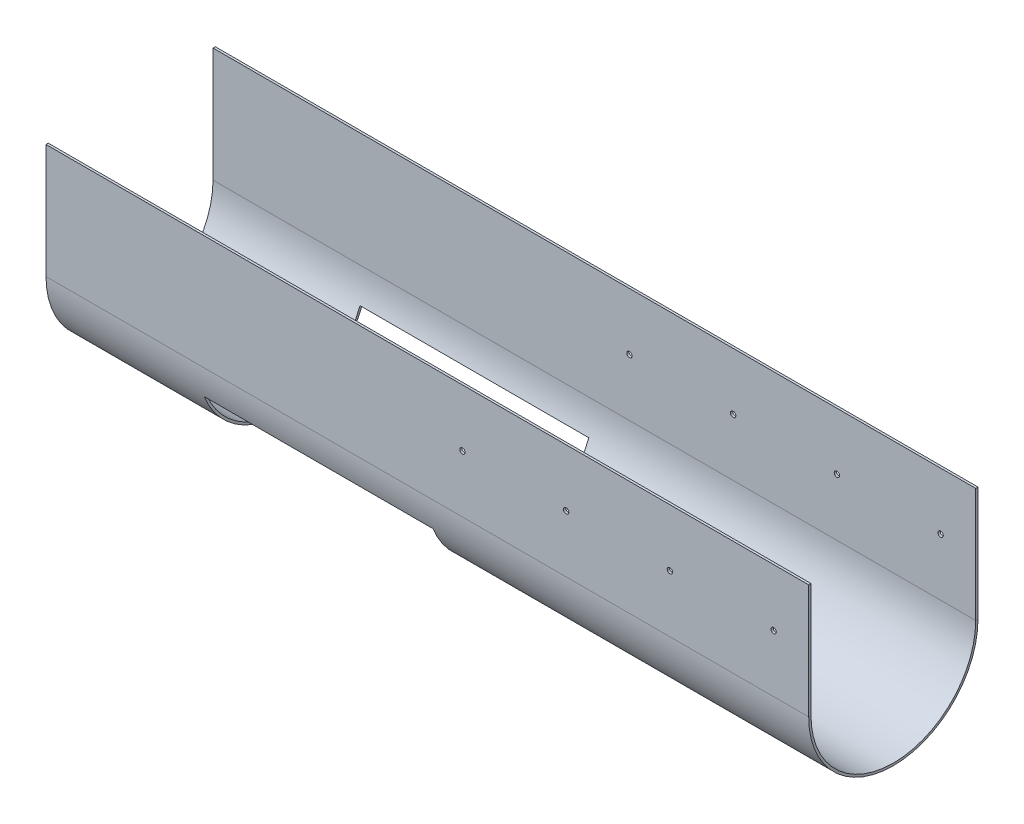
ISO-10303-21;
HEADER;
FILE_DESCRIPTION(('STEP AP214'),'2;1');
FILE_NAME('part.step','',(''),(''),'','','');
FILE_SCHEMA(('AUTOMOTIVE_DESIGN { 1 0 10303 214 1 1 1 1 }'));
ENDSEC;
DATA;
#1=APPLICATION_CONTEXT('core data for automotive mechanical design processes');
#2=APPLICATION_PROTOCOL_DEFINITION('international standard','automotive_design',2000,#1);
#3=PRODUCT_CONTEXT('',#1,'mechanical');
#4=PRODUCT('Part','Part','',(#3));
#5=PRODUCT_RELATED_PRODUCT_CATEGORY('part','',(#4));
#6=PRODUCT_DEFINITION_FORMATION('','',#4);
#7=PRODUCT_DEFINITION_CONTEXT('part definition',#1,'design');
#8=PRODUCT_DEFINITION('design','',#6,#7);
#9=PRODUCT_DEFINITION_SHAPE('','',#8);
#10=(LENGTH_UNIT() NAMED_UNIT(*) SI_UNIT(.MILLI.,.METRE.));
#11=(NAMED_UNIT(*) PLANE_ANGLE_UNIT() SI_UNIT($,.RADIAN.));
#12=(NAMED_UNIT(*) SI_UNIT($,.STERADIAN.) SOLID_ANGLE_UNIT());
#13=UNCERTAINTY_MEASURE_WITH_UNIT(LENGTH_MEASURE(1.E-05),#10,'distance_accuracy_value','');
#14=(GEOMETRIC_REPRESENTATION_CONTEXT(3) GLOBAL_UNCERTAINTY_ASSIGNED_CONTEXT((#13)) GLOBAL_UNIT_ASSIGNED_CONTEXT((#10,
#11,#12)) REPRESENTATION_CONTEXT('',''));
#15=CARTESIAN_POINT('',(0.,0.,0.));
#16=DIRECTION('',(0.,0.,1.));
#17=DIRECTION('',(1.,0.,0.));
#18=AXIS2_PLACEMENT_3D('',#15,#16,#17);
#19=CARTESIAN_POINT('',(500.,0.,0.));
#20=DIRECTION('',(1.,0.,0.));
#21=DIRECTION('',(0.,0.,-1.));
#22=AXIS2_PLACEMENT_3D('',#19,#20,#21);
#23=CYLINDRICAL_SURFACE('',#22,108.);
#24=DIRECTION('',(-1.,0.,0.));
#25=VECTOR('',#24,1.);
#26=CARTESIAN_POINT('',(500.,0.,-108.));
#27=LINE('',#26,#25);
#28=CARTESIAN_POINT('',(500.,0.,-108.));
#29=VERTEX_POINT('',#28);
#30=CARTESIAN_POINT('',(-500.,0.,-108.));
#31=VERTEX_POINT('',#30);
#32=EDGE_CURVE('E184',#29,#31,#27,.T.);
#33=ORIENTED_EDGE('',*,*,#32,.T.);
#34=CARTESIAN_POINT('',(-500.,0.,0.));
#35=DIRECTION('',(1.,0.,0.));
#36=DIRECTION('',(0.,0.,-1.));
#37=AXIS2_PLACEMENT_3D('',#34,#35,#36);
#38=CIRCLE('',#37,108.);
#39=CARTESIAN_POINT('',(-500.,0.,108.));
#40=VERTEX_POINT('',#39);
#41=EDGE_CURVE('E202',#40,#31,#38,.T.);
#42=ORIENTED_EDGE('',*,*,#41,.F.);
#43=DIRECTION('',(-1.,0.,0.));
#44=VECTOR('',#43,1.);
#45=CARTESIAN_POINT('',(500.,0.,108.));
#46=LINE('',#45,#44);
#47=CARTESIAN_POINT('',(500.,0.,108.));
#48=VERTEX_POINT('',#47);
#49=EDGE_CURVE('E193',#48,#40,#46,.T.);
#50=ORIENTED_EDGE('',*,*,#49,.F.);
#51=CARTESIAN_POINT('',(500.,0.,0.));
#52=DIRECTION('',(1.,0.,0.));
#53=DIRECTION('',(0.,0.,-1.));
#54=AXIS2_PLACEMENT_3D('',#51,#52,#53);
#55=CIRCLE('',#54,108.);
#56=EDGE_CURVE('E201',#48,#29,#55,.T.);
#57=ORIENTED_EDGE('',*,*,#56,.T.);
#58=EDGE_LOOP('',(#33,#42,#50,#57));
#59=FACE_BOUND('',#58,.T.);
#60=CARTESIAN_POINT('',(-300.,0.,0.));
#61=DIRECTION('',(1.,0.,0.));
#62=DIRECTION('',(0.,0.,1.));
#63=AXIS2_PLACEMENT_3D('',#60,#61,#62);
#64=CIRCLE('',#63,108.);
#65=CARTESIAN_POINT('',(-300.,-38.9189189189189,100.743822392158));
#66=VERTEX_POINT('',#65);
#67=CARTESIAN_POINT('',(-300.,-38.9189189189187,-100.743822392158));
#68=VERTEX_POINT('',#67);
#69=EDGE_CURVE('E176',#66,#68,#64,.T.);
#70=ORIENTED_EDGE('',*,*,#69,.T.);
#71=DIRECTION('',(1.,0.,0.));
#72=VECTOR('',#71,1.);
#73=CARTESIAN_POINT('',(0.,-38.9189189189187,-100.743822392158));
#74=LINE('',#73,#72);
#75=CARTESIAN_POINT('',(0.,-38.9189189189187,-100.743822392158));
#76=VERTEX_POINT('',#75);
#77=EDGE_CURVE('E162',#68,#76,#74,.T.);
#78=ORIENTED_EDGE('',*,*,#77,.T.);
#79=CARTESIAN_POINT('',(0.,0.,0.));
#80=DIRECTION('',(-1.,0.,0.));
#81=DIRECTION('',(0.,0.,-1.));
#82=AXIS2_PLACEMENT_3D('',#79,#80,#81);
#83=CIRCLE('',#82,108.);
#84=CARTESIAN_POINT('',(0.,-38.9189189189188,100.743822392158));
#85=VERTEX_POINT('',#84);
#86=EDGE_CURVE('E69',#76,#85,#83,.T.);
#87=ORIENTED_EDGE('',*,*,#86,.T.);
#88=DIRECTION('',(-1.,0.,0.));
#89=VECTOR('',#88,1.);
#90=CARTESIAN_POINT('',(-300.,-38.9189189189189,100.743822392158));
#91=LINE('',#90,#89);
#92=EDGE_CURVE('E151',#85,#66,#91,.T.);
#93=ORIENTED_EDGE('',*,*,#92,.T.);
#94=EDGE_LOOP('',(#70,#78,#87,#93));
#95=FACE_BOUND('',#94,.T.);
#96=ADVANCED_FACE('F52',(#59,#95),#23,.F.);
#97=CARTESIAN_POINT('',(500.,0.,0.));
#98=DIRECTION('',(1.,0.,0.));
#99=DIRECTION('',(0.,0.,-1.));
#100=AXIS2_PLACEMENT_3D('',#97,#98,#99);
#101=CYLINDRICAL_SURFACE('',#100,111.);
#102=DIRECTION('',(1.,0.,0.));
#103=VECTOR('',#102,1.);
#104=CARTESIAN_POINT('',(500.,0.,-111.));
#105=LINE('',#104,#103);
#106=CARTESIAN_POINT('',(500.,0.,-111.));
#107=VERTEX_POINT('',#106);
#108=CARTESIAN_POINT('',(-500.,0.,-111.));
#109=VERTEX_POINT('',#108);
#110=EDGE_CURVE('E225',#107,#109,#105,.F.);
#111=ORIENTED_EDGE('',*,*,#110,.F.);
#112=CARTESIAN_POINT('',(500.,0.,0.));
#113=DIRECTION('',(1.,0.,0.));
#114=DIRECTION('',(0.,0.,-1.));
#115=AXIS2_PLACEMENT_3D('',#112,#113,#114);
#116=CIRCLE('',#115,111.);
#117=CARTESIAN_POINT('',(500.,0.,111.));
#118=VERTEX_POINT('',#117);
#119=EDGE_CURVE('E229',#118,#107,#116,.T.);
#120=ORIENTED_EDGE('',*,*,#119,.F.);
#121=DIRECTION('',(-1.,0.,0.));
#122=VECTOR('',#121,1.);
#123=CARTESIAN_POINT('',(0.,0.,111.));
#124=LINE('',#123,#122);
#125=CARTESIAN_POINT('',(-500.,0.,111.));
#126=VERTEX_POINT('',#125);
#127=EDGE_CURVE('E179',#118,#126,#124,.T.);
#128=ORIENTED_EDGE('',*,*,#127,.T.);
#129=CARTESIAN_POINT('',(-500.,0.,0.));
#130=DIRECTION('',(1.,0.,0.));
#131=DIRECTION('',(0.,0.,-1.));
#132=AXIS2_PLACEMENT_3D('',#129,#130,#131);
#133=CIRCLE('',#132,111.);
#134=EDGE_CURVE('E235',#126,#109,#133,.T.);
#135=ORIENTED_EDGE('',*,*,#134,.T.);
#136=EDGE_LOOP('',(#111,#120,#128,#135));
#137=FACE_BOUND('',#136,.T.);
#138=DIRECTION('',(-1.,0.,0.));
#139=VECTOR('',#138,1.);
#140=CARTESIAN_POINT('',(1057.51975119624,-39.9999999999997,-103.542261903051));
#141=LINE('',#140,#139);
#142=CARTESIAN_POINT('',(-300.,-39.9999999999997,-103.542261903051));
#143=VERTEX_POINT('',#142);
#144=CARTESIAN_POINT('',(0.,-39.9999999999997,-103.542261903051));
#145=VERTEX_POINT('',#144);
#146=EDGE_CURVE('E419',#143,#145,#141,.F.);
#147=ORIENTED_EDGE('',*,*,#146,.F.);
#148=CARTESIAN_POINT('',(-300.,0.,0.));
#149=DIRECTION('',(-1.,0.,0.));
#150=DIRECTION('',(0.,0.,1.));
#151=AXIS2_PLACEMENT_3D('',#148,#149,#150);
#152=CIRCLE('',#151,111.);
#153=CARTESIAN_POINT('',(-300.,-40.,103.542261903051));
#154=VERTEX_POINT('',#153);
#155=EDGE_CURVE('E159',#154,#143,#152,.F.);
#156=ORIENTED_EDGE('',*,*,#155,.F.);
#157=DIRECTION('',(-1.,0.,0.));
#158=VECTOR('',#157,1.);
#159=CARTESIAN_POINT('',(1057.51975119624,-40.,103.542261903051));
#160=LINE('',#159,#158);
#161=CARTESIAN_POINT('',(0.,-39.9999999999999,103.542261903051));
#162=VERTEX_POINT('',#161);
#163=EDGE_CURVE('E164',#162,#154,#160,.T.);
#164=ORIENTED_EDGE('',*,*,#163,.F.);
#165=CARTESIAN_POINT('',(0.,0.,0.));
#166=DIRECTION('',(-1.,0.,0.));
#167=DIRECTION('',(0.,0.,1.));
#168=AXIS2_PLACEMENT_3D('',#165,#166,#167);
#169=CIRCLE('',#168,111.);
#170=EDGE_CURVE('E145',#145,#162,#169,.T.);
#171=ORIENTED_EDGE('',*,*,#170,.F.);
#172=EDGE_LOOP('',(#147,#156,#164,#171));
#173=FACE_BOUND('',#172,.T.);
#174=ADVANCED_FACE('F305',(#137,#173),#101,.T.);
#175=CARTESIAN_POINT('',(500.,0.,108.));
#176=DIRECTION('',(-1.,0.,0.));
#177=DIRECTION('',(0.,1.,0.));
#178=AXIS2_PLACEMENT_3D('',#175,#176,#177);
#179=PLANE('',#178);
#180=DIRECTION('',(0.,0.,-1.));
#181=VECTOR('',#180,1.);
#182=CARTESIAN_POINT('',(500.,150.,108.));
#183=LINE('',#182,#181);
#184=CARTESIAN_POINT('',(500.,150.,111.));
#185=VERTEX_POINT('',#184);
#186=CARTESIAN_POINT('',(500.,150.,108.));
#187=VERTEX_POINT('',#186);
#188=EDGE_CURVE('E12',#185,#187,#183,.T.);
#189=ORIENTED_EDGE('',*,*,#188,.F.);
#190=DIRECTION('',(0.,1.,0.));
#191=VECTOR('',#190,1.);
#192=CARTESIAN_POINT('',(500.,0.,111.));
#193=LINE('',#192,#191);
#194=EDGE_CURVE('E230',#118,#185,#193,.T.);
#195=ORIENTED_EDGE('',*,*,#194,.F.);
#196=DIRECTION('',(0.,0.,-1.));
#197=VECTOR('',#196,1.);
#198=CARTESIAN_POINT('',(500.,0.,108.));
#199=LINE('',#198,#197);
#200=EDGE_CURVE('E62',#118,#48,#199,.T.);
#201=ORIENTED_EDGE('',*,*,#200,.T.);
#202=DIRECTION('',(0.,1.,0.));
#203=VECTOR('',#202,1.);
#204=CARTESIAN_POINT('',(500.,0.,108.));
#205=LINE('',#204,#203);
#206=EDGE_CURVE('E180',#48,#187,#205,.T.);
#207=ORIENTED_EDGE('',*,*,#206,.T.);
#208=EDGE_LOOP('',(#189,#195,#201,#207));
#209=FACE_BOUND('',#208,.T.);
#210=ADVANCED_FACE('F280',(#209),#179,.F.);
#211=CARTESIAN_POINT('',(500.,0.,0.));
#212=DIRECTION('',(-1.,0.,0.));
#213=DIRECTION('',(0.,0.,1.));
#214=AXIS2_PLACEMENT_3D('',#211,#212,#213);
#215=PLANE('',#214);
#216=ORIENTED_EDGE('',*,*,#200,.F.);
#217=ORIENTED_EDGE('',*,*,#119,.T.);
#218=DIRECTION('',(0.,0.,1.));
#219=VECTOR('',#218,1.);
#220=CARTESIAN_POINT('',(500.,0.,-108.));
#221=LINE('',#220,#219);
#222=EDGE_CURVE('E271',#107,#29,#221,.T.);
#223=ORIENTED_EDGE('',*,*,#222,.T.);
#224=ORIENTED_EDGE('',*,*,#56,.F.);
#225=EDGE_LOOP('',(#216,#217,#223,#224));
#226=FACE_BOUND('',#225,.T.);
#227=ADVANCED_FACE('F288',(#226),#215,.F.);
#228=CARTESIAN_POINT('',(500.,150.,-108.));
#229=DIRECTION('',(-1.,0.,0.));
#230=DIRECTION('',(0.,-1.,0.));
#231=AXIS2_PLACEMENT_3D('',#228,#229,#230);
#232=PLANE('',#231);
#233=ORIENTED_EDGE('',*,*,#222,.F.);
#234=DIRECTION('',(0.,-1.,0.));
#235=VECTOR('',#234,1.);
#236=CARTESIAN_POINT('',(500.,0.,-111.));
#237=LINE('',#236,#235);
#238=CARTESIAN_POINT('',(500.,150.,-111.));
#239=VERTEX_POINT('',#238);
#240=EDGE_CURVE('E197',#239,#107,#237,.T.);
#241=ORIENTED_EDGE('',*,*,#240,.F.);
#242=DIRECTION('',(0.,0.,1.));
#243=VECTOR('',#242,1.);
#244=CARTESIAN_POINT('',(500.,150.,-108.));
#245=LINE('',#244,#243);
#246=CARTESIAN_POINT('',(500.,150.,-108.));
#247=VERTEX_POINT('',#246);
#248=EDGE_CURVE('E268',#239,#247,#245,.T.);
#249=ORIENTED_EDGE('',*,*,#248,.T.);
#250=DIRECTION('',(0.,-1.,0.));
#251=VECTOR('',#250,1.);
#252=CARTESIAN_POINT('',(500.,150.,-108.));
#253=LINE('',#252,#251);
#254=EDGE_CURVE('E210',#247,#29,#253,.T.);
#255=ORIENTED_EDGE('',*,*,#254,.T.);
#256=EDGE_LOOP('',(#233,#241,#249,#255));
#257=FACE_BOUND('',#256,.T.);
#258=ADVANCED_FACE('F313',(#257),#232,.F.);
#259=CARTESIAN_POINT('',(500.,150.,-108.));
#260=DIRECTION('',(0.,1.,0.));
#261=DIRECTION('',(-1.,0.,0.));
#262=AXIS2_PLACEMENT_3D('',#259,#260,#261);
#263=PLANE('',#262);
#264=ORIENTED_EDGE('',*,*,#248,.F.);
#265=DIRECTION('',(1.,0.,0.));
#266=VECTOR('',#265,1.);
#267=CARTESIAN_POINT('',(0.,150.,-111.));
#268=LINE('',#267,#266);
#269=CARTESIAN_POINT('',(-500.,150.,-111.));
#270=VERTEX_POINT('',#269);
#271=EDGE_CURVE('E239',#239,#270,#268,.F.);
#272=ORIENTED_EDGE('',*,*,#271,.T.);
#273=DIRECTION('',(0.,0.,1.));
#274=VECTOR('',#273,1.);
#275=CARTESIAN_POINT('',(-500.,150.,-108.));
#276=LINE('',#275,#274);
#277=CARTESIAN_POINT('',(-500.,150.,-108.));
#278=VERTEX_POINT('',#277);
#279=EDGE_CURVE('E265',#270,#278,#276,.T.);
#280=ORIENTED_EDGE('',*,*,#279,.T.);
#281=DIRECTION('',(-1.,0.,0.));
#282=VECTOR('',#281,1.);
#283=CARTESIAN_POINT('',(500.,150.,-108.));
#284=LINE('',#283,#282);
#285=EDGE_CURVE('E206',#247,#278,#284,.T.);
#286=ORIENTED_EDGE('',*,*,#285,.F.);
#287=EDGE_LOOP('',(#264,#272,#280,#286));
#288=FACE_BOUND('',#287,.T.);
#289=ADVANCED_FACE('F328',(#288),#263,.T.);
#290=CARTESIAN_POINT('',(-500.,150.,-108.));
#291=DIRECTION('',(-1.,0.,0.));
#292=DIRECTION('',(0.,-1.,0.));
#293=AXIS2_PLACEMENT_3D('',#290,#291,#292);
#294=PLANE('',#293);
#295=ORIENTED_EDGE('',*,*,#279,.F.);
#296=DIRECTION('',(0.,-1.,0.));
#297=VECTOR('',#296,1.);
#298=CARTESIAN_POINT('',(-500.,0.,-111.));
#299=LINE('',#298,#297);
#300=EDGE_CURVE('E240',#270,#109,#299,.T.);
#301=ORIENTED_EDGE('',*,*,#300,.T.);
#302=DIRECTION('',(0.,0.,1.));
#303=VECTOR('',#302,1.);
#304=CARTESIAN_POINT('',(-500.,0.,-108.));
#305=LINE('',#304,#303);
#306=EDGE_CURVE('E262',#109,#31,#305,.T.);
#307=ORIENTED_EDGE('',*,*,#306,.T.);
#308=DIRECTION('',(0.,-1.,0.));
#309=VECTOR('',#308,1.);
#310=CARTESIAN_POINT('',(-500.,150.,-108.));
#311=LINE('',#310,#309);
#312=EDGE_CURVE('E214',#278,#31,#311,.T.);
#313=ORIENTED_EDGE('',*,*,#312,.F.);
#314=EDGE_LOOP('',(#295,#301,#307,#313));
#315=FACE_BOUND('',#314,.T.);
#316=ADVANCED_FACE('F320',(#315),#294,.T.);
#317=CARTESIAN_POINT('',(-500.,0.,0.));
#318=DIRECTION('',(-1.,0.,0.));
#319=DIRECTION('',(0.,0.,1.));
#320=AXIS2_PLACEMENT_3D('',#317,#318,#319);
#321=PLANE('',#320);
#322=ORIENTED_EDGE('',*,*,#306,.F.);
#323=ORIENTED_EDGE('',*,*,#134,.F.);
#324=DIRECTION('',(0.,0.,-1.));
#325=VECTOR('',#324,1.);
#326=CARTESIAN_POINT('',(-500.,0.,108.));
#327=LINE('',#326,#325);
#328=EDGE_CURVE('E259',#126,#40,#327,.T.);
#329=ORIENTED_EDGE('',*,*,#328,.T.);
#330=ORIENTED_EDGE('',*,*,#41,.T.);
#331=EDGE_LOOP('',(#322,#323,#329,#330));
#332=FACE_BOUND('',#331,.T.);
#333=ADVANCED_FACE('F321',(#332),#321,.T.);
#334=CARTESIAN_POINT('',(-500.,0.,108.));
#335=DIRECTION('',(-1.,0.,0.));
#336=DIRECTION('',(0.,1.,0.));
#337=AXIS2_PLACEMENT_3D('',#334,#335,#336);
#338=PLANE('',#337);
#339=ORIENTED_EDGE('',*,*,#328,.F.);
#340=DIRECTION('',(0.,1.,0.));
#341=VECTOR('',#340,1.);
#342=CARTESIAN_POINT('',(-500.,0.,111.));
#343=LINE('',#342,#341);
#344=CARTESIAN_POINT('',(-500.,150.,111.));
#345=VERTEX_POINT('',#344);
#346=EDGE_CURVE('E224',#126,#345,#343,.T.);
#347=ORIENTED_EDGE('',*,*,#346,.T.);
#348=DIRECTION('',(0.,0.,-1.));
#349=VECTOR('',#348,1.);
#350=CARTESIAN_POINT('',(-500.,150.,108.));
#351=LINE('',#350,#349);
#352=CARTESIAN_POINT('',(-500.,150.,108.));
#353=VERTEX_POINT('',#352);
#354=EDGE_CURVE('E56',#345,#353,#351,.T.);
#355=ORIENTED_EDGE('',*,*,#354,.T.);
#356=DIRECTION('',(0.,1.,0.));
#357=VECTOR('',#356,1.);
#358=CARTESIAN_POINT('',(-500.,0.,108.));
#359=LINE('',#358,#357);
#360=EDGE_CURVE('E189',#40,#353,#359,.T.);
#361=ORIENTED_EDGE('',*,*,#360,.F.);
#362=EDGE_LOOP('',(#339,#347,#355,#361));
#363=FACE_BOUND('',#362,.T.);
#364=ADVANCED_FACE('F295',(#363),#338,.T.);
#365=CARTESIAN_POINT('',(500.,150.,108.));
#366=DIRECTION('',(0.,-1.,0.));
#367=DIRECTION('',(-1.,0.,0.));
#368=AXIS2_PLACEMENT_3D('',#365,#366,#367);
#369=PLANE('',#368);
#370=DIRECTION('',(-1.,0.,0.));
#371=VECTOR('',#370,1.);
#372=CARTESIAN_POINT('',(0.,150.,111.));
#373=LINE('',#372,#371);
#374=EDGE_CURVE('E234',#185,#345,#373,.T.);
#375=ORIENTED_EDGE('',*,*,#374,.F.);
#376=ORIENTED_EDGE('',*,*,#188,.T.);
#377=DIRECTION('',(-1.,0.,0.));
#378=VECTOR('',#377,1.);
#379=CARTESIAN_POINT('',(500.,150.,108.));
#380=LINE('',#379,#378);
#381=EDGE_CURVE('E185',#187,#353,#380,.T.);
#382=ORIENTED_EDGE('',*,*,#381,.T.);
#383=ORIENTED_EDGE('',*,*,#354,.F.);
#384=EDGE_LOOP('',(#375,#376,#382,#383));
#385=FACE_BOUND('',#384,.T.);
#386=ADVANCED_FACE('F54',(#385),#369,.F.);
#387=CARTESIAN_POINT('',(0.,0.,108.));
#388=DIRECTION('',(0.,0.,-1.));
#389=DIRECTION('',(-1.,0.,0.));
#390=AXIS2_PLACEMENT_3D('',#387,#388,#389);
#391=PLANE('',#390);
#392=CARTESIAN_POINT('',(454.,74.9999999999999,108.));
#393=DIRECTION('',(0.,0.,-1.));
#394=DIRECTION('',(-1.,0.,0.));
#395=AXIS2_PLACEMENT_3D('',#392,#393,#394);
#396=CIRCLE('',#395,3.50000000000002);
#397=CARTESIAN_POINT('',(450.5,74.9999999999999,108.));
#398=VERTEX_POINT('',#397);
#399=EDGE_CURVE('E413',#398,#398,#396,.T.);
#400=ORIENTED_EDGE('',*,*,#399,.F.);
#401=EDGE_LOOP('',(#400));
#402=FACE_BOUND('',#401,.T.);
#403=CARTESIAN_POINT('',(182.,74.9999999999999,108.));
#404=DIRECTION('',(0.,0.,-1.));
#405=DIRECTION('',(-1.,0.,0.));
#406=AXIS2_PLACEMENT_3D('',#403,#404,#405);
#407=CIRCLE('',#406,3.49999999999999);
#408=CARTESIAN_POINT('',(178.5,74.9999999999999,108.));
#409=VERTEX_POINT('',#408);
#410=EDGE_CURVE('E405',#409,#409,#407,.T.);
#411=ORIENTED_EDGE('',*,*,#410,.F.);
#412=EDGE_LOOP('',(#411));
#413=FACE_BOUND('',#412,.T.);
#414=CARTESIAN_POINT('',(318.,74.9999999999999,108.));
#415=DIRECTION('',(0.,0.,-1.));
#416=DIRECTION('',(-1.,0.,0.));
#417=AXIS2_PLACEMENT_3D('',#414,#415,#416);
#418=CIRCLE('',#417,3.50000000000002);
#419=CARTESIAN_POINT('',(314.5,74.9999999999999,108.));
#420=VERTEX_POINT('',#419);
#421=EDGE_CURVE('E397',#420,#420,#418,.T.);
#422=ORIENTED_EDGE('',*,*,#421,.F.);
#423=EDGE_LOOP('',(#422));
#424=FACE_BOUND('',#423,.T.);
#425=CARTESIAN_POINT('',(46.,74.9999999999999,108.));
#426=DIRECTION('',(0.,0.,-1.));
#427=DIRECTION('',(-1.,0.,0.));
#428=AXIS2_PLACEMENT_3D('',#425,#426,#427);
#429=CIRCLE('',#428,3.5);
#430=CARTESIAN_POINT('',(42.5,74.9999999999999,108.));
#431=VERTEX_POINT('',#430);
#432=EDGE_CURVE('E389',#431,#431,#429,.T.);
#433=ORIENTED_EDGE('',*,*,#432,.F.);
#434=EDGE_LOOP('',(#433));
#435=FACE_BOUND('',#434,.T.);
#436=ORIENTED_EDGE('',*,*,#49,.T.);
#437=ORIENTED_EDGE('',*,*,#360,.T.);
#438=ORIENTED_EDGE('',*,*,#381,.F.);
#439=ORIENTED_EDGE('',*,*,#206,.F.);
#440=EDGE_LOOP('',(#436,#437,#438,#439));
#441=FACE_BOUND('',#440,.T.);
#442=ADVANCED_FACE('F286',(#402,#413,#424,#435,#441),#391,.T.);
#443=CARTESIAN_POINT('',(0.,0.,-108.));
#444=DIRECTION('',(0.,0.,1.));
#445=DIRECTION('',(0.,-1.,0.));
#446=AXIS2_PLACEMENT_3D('',#443,#444,#445);
#447=PLANE('',#446);
#448=CARTESIAN_POINT('',(454.,74.9999999999999,-108.));
#449=DIRECTION('',(0.,0.,1.));
#450=DIRECTION('',(0.,-1.,0.));
#451=AXIS2_PLACEMENT_3D('',#448,#449,#450);
#452=CIRCLE('',#451,3.50000000000002);
#453=CARTESIAN_POINT('',(454.,71.4999999999999,-108.));
#454=VERTEX_POINT('',#453);
#455=EDGE_CURVE('E409',#454,#454,#452,.T.);
#456=ORIENTED_EDGE('',*,*,#455,.F.);
#457=EDGE_LOOP('',(#456));
#458=FACE_BOUND('',#457,.T.);
#459=CARTESIAN_POINT('',(182.,74.9999999999999,-108.));
#460=DIRECTION('',(0.,0.,1.));
#461=DIRECTION('',(0.,-1.,0.));
#462=AXIS2_PLACEMENT_3D('',#459,#460,#461);
#463=CIRCLE('',#462,3.49999999999999);
#464=CARTESIAN_POINT('',(182.,71.4999999999999,-108.));
#465=VERTEX_POINT('',#464);
#466=EDGE_CURVE('E401',#465,#465,#463,.T.);
#467=ORIENTED_EDGE('',*,*,#466,.F.);
#468=EDGE_LOOP('',(#467));
#469=FACE_BOUND('',#468,.T.);
#470=CARTESIAN_POINT('',(318.,74.9999999999999,-108.));
#471=DIRECTION('',(0.,0.,1.));
#472=DIRECTION('',(0.,-1.,0.));
#473=AXIS2_PLACEMENT_3D('',#470,#471,#472);
#474=CIRCLE('',#473,3.50000000000002);
#475=CARTESIAN_POINT('',(318.,71.4999999999999,-108.));
#476=VERTEX_POINT('',#475);
#477=EDGE_CURVE('E393',#476,#476,#474,.T.);
#478=ORIENTED_EDGE('',*,*,#477,.F.);
#479=EDGE_LOOP('',(#478));
#480=FACE_BOUND('',#479,.T.);
#481=CARTESIAN_POINT('',(46.,74.9999999999999,-108.));
#482=DIRECTION('',(0.,0.,1.));
#483=DIRECTION('',(0.,-1.,0.));
#484=AXIS2_PLACEMENT_3D('',#481,#482,#483);
#485=CIRCLE('',#484,3.5);
#486=CARTESIAN_POINT('',(46.,71.4999999999999,-108.));
#487=VERTEX_POINT('',#486);
#488=EDGE_CURVE('E385',#487,#487,#485,.T.);
#489=ORIENTED_EDGE('',*,*,#488,.F.);
#490=EDGE_LOOP('',(#489));
#491=FACE_BOUND('',#490,.T.);
#492=ORIENTED_EDGE('',*,*,#285,.T.);
#493=ORIENTED_EDGE('',*,*,#312,.T.);
#494=ORIENTED_EDGE('',*,*,#32,.F.);
#495=ORIENTED_EDGE('',*,*,#254,.F.);
#496=EDGE_LOOP('',(#492,#493,#494,#495));
#497=FACE_BOUND('',#496,.T.);
#498=ADVANCED_FACE('F317',(#458,#469,#480,#491,#497),#447,.T.);
#499=CARTESIAN_POINT('',(0.,0.,111.));
#500=DIRECTION('',(0.,0.,-1.));
#501=DIRECTION('',(-1.,0.,0.));
#502=AXIS2_PLACEMENT_3D('',#499,#500,#501);
#503=PLANE('',#502);
#504=CARTESIAN_POINT('',(454.,74.9999999999999,111.));
#505=DIRECTION('',(0.,0.,1.));
#506=DIRECTION('',(1.,0.,0.));
#507=AXIS2_PLACEMENT_3D('',#504,#505,#506);
#508=CIRCLE('',#507,3.50000000000002);
#509=CARTESIAN_POINT('',(457.5,74.9999999999999,111.));
#510=VERTEX_POINT('',#509);
#511=EDGE_CURVE('E375',#510,#510,#508,.T.);
#512=ORIENTED_EDGE('',*,*,#511,.F.);
#513=EDGE_LOOP('',(#512));
#514=FACE_BOUND('',#513,.T.);
#515=CARTESIAN_POINT('',(182.,74.9999999999999,111.));
#516=DIRECTION('',(0.,0.,1.));
#517=DIRECTION('',(1.,0.,0.));
#518=AXIS2_PLACEMENT_3D('',#515,#516,#517);
#519=CIRCLE('',#518,3.49999999999999);
#520=CARTESIAN_POINT('',(185.5,74.9999999999999,111.));
#521=VERTEX_POINT('',#520);
#522=EDGE_CURVE('E380',#521,#521,#519,.T.);
#523=ORIENTED_EDGE('',*,*,#522,.F.);
#524=EDGE_LOOP('',(#523));
#525=FACE_BOUND('',#524,.T.);
#526=CARTESIAN_POINT('',(318.,74.9999999999999,111.));
#527=DIRECTION('',(0.,0.,1.));
#528=DIRECTION('',(1.,0.,0.));
#529=AXIS2_PLACEMENT_3D('',#526,#527,#528);
#530=CIRCLE('',#529,3.50000000000002);
#531=CARTESIAN_POINT('',(321.5,74.9999999999999,111.));
#532=VERTEX_POINT('',#531);
#533=EDGE_CURVE('E368',#532,#532,#530,.T.);
#534=ORIENTED_EDGE('',*,*,#533,.F.);
#535=EDGE_LOOP('',(#534));
#536=FACE_BOUND('',#535,.T.);
#537=CARTESIAN_POINT('',(46.,74.9999999999999,111.));
#538=DIRECTION('',(0.,0.,1.));
#539=DIRECTION('',(1.,0.,0.));
#540=AXIS2_PLACEMENT_3D('',#537,#538,#539);
#541=CIRCLE('',#540,3.5);
#542=CARTESIAN_POINT('',(49.5,74.9999999999999,111.));
#543=VERTEX_POINT('',#542);
#544=EDGE_CURVE('E367',#543,#543,#541,.T.);
#545=ORIENTED_EDGE('',*,*,#544,.F.);
#546=EDGE_LOOP('',(#545));
#547=FACE_BOUND('',#546,.T.);
#548=ORIENTED_EDGE('',*,*,#127,.F.);
#549=ORIENTED_EDGE('',*,*,#194,.T.);
#550=ORIENTED_EDGE('',*,*,#374,.T.);
#551=ORIENTED_EDGE('',*,*,#346,.F.);
#552=EDGE_LOOP('',(#548,#549,#550,#551));
#553=FACE_BOUND('',#552,.T.);
#554=ADVANCED_FACE('F299',(#514,#525,#536,#547,#553),#503,.F.);
#555=CARTESIAN_POINT('',(0.,0.,-111.));
#556=DIRECTION('',(0.,0.,1.));
#557=DIRECTION('',(0.,-1.,0.));
#558=AXIS2_PLACEMENT_3D('',#555,#556,#557);
#559=PLANE('',#558);
#560=CARTESIAN_POINT('',(454.,74.9999999999999,-111.));
#561=DIRECTION('',(0.,0.,1.));
#562=DIRECTION('',(1.,0.,0.));
#563=AXIS2_PLACEMENT_3D('',#560,#561,#562);
#564=CIRCLE('',#563,3.50000000000002);
#565=CARTESIAN_POINT('',(457.5,74.9999999999999,-111.));
#566=VERTEX_POINT('',#565);
#567=EDGE_CURVE('E353',#566,#566,#564,.T.);
#568=ORIENTED_EDGE('',*,*,#567,.T.);
#569=EDGE_LOOP('',(#568));
#570=FACE_BOUND('',#569,.T.);
#571=CARTESIAN_POINT('',(182.,74.9999999999999,-111.));
#572=DIRECTION('',(0.,0.,1.));
#573=DIRECTION('',(1.,0.,0.));
#574=AXIS2_PLACEMENT_3D('',#571,#572,#573);
#575=CIRCLE('',#574,3.49999999999999);
#576=CARTESIAN_POINT('',(185.5,74.9999999999999,-111.));
#577=VERTEX_POINT('',#576);
#578=EDGE_CURVE('E357',#577,#577,#575,.T.);
#579=ORIENTED_EDGE('',*,*,#578,.T.);
#580=EDGE_LOOP('',(#579));
#581=FACE_BOUND('',#580,.T.);
#582=CARTESIAN_POINT('',(318.,74.9999999999999,-111.));
#583=DIRECTION('',(0.,0.,1.));
#584=DIRECTION('',(1.,0.,0.));
#585=AXIS2_PLACEMENT_3D('',#582,#583,#584);
#586=CIRCLE('',#585,3.50000000000002);
#587=CARTESIAN_POINT('',(321.5,74.9999999999999,-111.));
#588=VERTEX_POINT('',#587);
#589=EDGE_CURVE('E361',#588,#588,#586,.T.);
#590=ORIENTED_EDGE('',*,*,#589,.T.);
#591=EDGE_LOOP('',(#590));
#592=FACE_BOUND('',#591,.T.);
#593=CARTESIAN_POINT('',(46.,74.9999999999999,-111.));
#594=DIRECTION('',(0.,0.,1.));
#595=DIRECTION('',(1.,0.,0.));
#596=AXIS2_PLACEMENT_3D('',#593,#594,#595);
#597=CIRCLE('',#596,3.5);
#598=CARTESIAN_POINT('',(49.5,74.9999999999999,-111.));
#599=VERTEX_POINT('',#598);
#600=EDGE_CURVE('E364',#599,#599,#597,.T.);
#601=ORIENTED_EDGE('',*,*,#600,.T.);
#602=EDGE_LOOP('',(#601));
#603=FACE_BOUND('',#602,.T.);
#604=ORIENTED_EDGE('',*,*,#271,.F.);
#605=ORIENTED_EDGE('',*,*,#240,.T.);
#606=ORIENTED_EDGE('',*,*,#110,.T.);
#607=ORIENTED_EDGE('',*,*,#300,.F.);
#608=EDGE_LOOP('',(#604,#605,#606,#607));
#609=FACE_BOUND('',#608,.T.);
#610=ADVANCED_FACE('F310',(#570,#581,#592,#603,#609),#559,.F.);
#611=CARTESIAN_POINT('',(-300.,0.,0.));
#612=DIRECTION('',(-1.,0.,0.));
#613=DIRECTION('',(0.,0.,1.));
#614=AXIS2_PLACEMENT_3D('',#611,#612,#613);
#615=PLANE('',#614);
#616=ORIENTED_EDGE('',*,*,#155,.T.);
#617=DIRECTION('',(0.,0.360360360360358,0.932813170297757));
#618=VECTOR('',#617,1.);
#619=CARTESIAN_POINT('',(-300.,-38.9189189189187,-100.743822392158));
#620=LINE('',#619,#618);
#621=EDGE_CURVE('E77',#143,#68,#620,.T.);
#622=ORIENTED_EDGE('',*,*,#621,.T.);
#623=ORIENTED_EDGE('',*,*,#69,.F.);
#624=DIRECTION('',(0.,0.36036036036036,-0.932813170297757));
#625=VECTOR('',#624,1.);
#626=CARTESIAN_POINT('',(-300.,-38.9189189189189,100.743822392158));
#627=LINE('',#626,#625);
#628=EDGE_CURVE('E154',#154,#66,#627,.T.);
#629=ORIENTED_EDGE('',*,*,#628,.F.);
#630=EDGE_LOOP('',(#616,#622,#623,#629));
#631=FACE_BOUND('',#630,.T.);
#632=ADVANCED_FACE('F345',(#631),#615,.F.);
#633=CARTESIAN_POINT('',(-150.,-38.9189189189189,100.743822392158));
#634=DIRECTION('',(0.,0.932813170297757,0.36036036036036));
#635=DIRECTION('',(-1.,0.,0.));
#636=AXIS2_PLACEMENT_3D('',#633,#634,#635);
#637=PLANE('',#636);
#638=DIRECTION('',(0.,0.360360360360359,-0.932813170297757));
#639=VECTOR('',#638,1.);
#640=CARTESIAN_POINT('',(0.,-38.9189189189188,100.743822392158));
#641=LINE('',#640,#639);
#642=EDGE_CURVE('E141',#162,#85,#641,.T.);
#643=ORIENTED_EDGE('',*,*,#642,.F.);
#644=ORIENTED_EDGE('',*,*,#163,.T.);
#645=ORIENTED_EDGE('',*,*,#628,.T.);
#646=ORIENTED_EDGE('',*,*,#92,.F.);
#647=EDGE_LOOP('',(#643,#644,#645,#646));
#648=FACE_BOUND('',#647,.T.);
#649=ADVANCED_FACE('F152',(#648),#637,.F.);
#650=CARTESIAN_POINT('',(0.,0.,0.));
#651=DIRECTION('',(1.,0.,0.));
#652=DIRECTION('',(0.,0.,-1.));
#653=AXIS2_PLACEMENT_3D('',#650,#651,#652);
#654=PLANE('',#653);
#655=DIRECTION('',(0.,0.360360360360358,0.932813170297757));
#656=VECTOR('',#655,1.);
#657=CARTESIAN_POINT('',(0.,-38.9189189189187,-100.743822392158));
#658=LINE('',#657,#656);
#659=EDGE_CURVE('E422',#145,#76,#658,.T.);
#660=ORIENTED_EDGE('',*,*,#659,.F.);
#661=ORIENTED_EDGE('',*,*,#170,.T.);
#662=ORIENTED_EDGE('',*,*,#642,.T.);
#663=ORIENTED_EDGE('',*,*,#86,.F.);
#664=EDGE_LOOP('',(#660,#661,#662,#663));
#665=FACE_BOUND('',#664,.T.);
#666=ADVANCED_FACE('F143',(#665),#654,.F.);
#667=CARTESIAN_POINT('',(-150.,-38.9189189189187,-100.743822392158));
#668=DIRECTION('',(0.,0.932813170297757,-0.360360360360358));
#669=DIRECTION('',(1.,0.,0.));
#670=AXIS2_PLACEMENT_3D('',#667,#668,#669);
#671=PLANE('',#670);
#672=ORIENTED_EDGE('',*,*,#621,.F.);
#673=ORIENTED_EDGE('',*,*,#146,.T.);
#674=ORIENTED_EDGE('',*,*,#659,.T.);
#675=ORIENTED_EDGE('',*,*,#77,.F.);
#676=EDGE_LOOP('',(#672,#673,#674,#675));
#677=FACE_BOUND('',#676,.T.);
#678=ADVANCED_FACE('F570',(#677),#671,.F.);
#679=CARTESIAN_POINT('',(46.,74.9999999999999,-111.));
#680=DIRECTION('',(0.,0.,1.));
#681=DIRECTION('',(1.,0.,0.));
#682=AXIS2_PLACEMENT_3D('',#679,#680,#681);
#683=CYLINDRICAL_SURFACE('',#682,3.5);
#684=ORIENTED_EDGE('',*,*,#488,.T.);
#685=EDGE_LOOP('',(#684));
#686=FACE_BOUND('',#685,.T.);
#687=ORIENTED_EDGE('',*,*,#600,.F.);
#688=EDGE_LOOP('',(#687));
#689=FACE_BOUND('',#688,.T.);
#690=ADVANCED_FACE('F557',(#686,#689),#683,.F.);
#691=CARTESIAN_POINT('',(318.,74.9999999999999,-111.));
#692=DIRECTION('',(0.,0.,1.));
#693=DIRECTION('',(1.,0.,0.));
#694=AXIS2_PLACEMENT_3D('',#691,#692,#693);
#695=CYLINDRICAL_SURFACE('',#694,3.50000000000002);
#696=ORIENTED_EDGE('',*,*,#477,.T.);
#697=EDGE_LOOP('',(#696));
#698=FACE_BOUND('',#697,.T.);
#699=ORIENTED_EDGE('',*,*,#589,.F.);
#700=EDGE_LOOP('',(#699));
#701=FACE_BOUND('',#700,.T.);
#702=ADVANCED_FACE('F563',(#698,#701),#695,.F.);
#703=CARTESIAN_POINT('',(182.,74.9999999999999,-111.));
#704=DIRECTION('',(0.,0.,1.));
#705=DIRECTION('',(1.,0.,0.));
#706=AXIS2_PLACEMENT_3D('',#703,#704,#705);
#707=CYLINDRICAL_SURFACE('',#706,3.49999999999999);
#708=ORIENTED_EDGE('',*,*,#466,.T.);
#709=EDGE_LOOP('',(#708));
#710=FACE_BOUND('',#709,.T.);
#711=ORIENTED_EDGE('',*,*,#578,.F.);
#712=EDGE_LOOP('',(#711));
#713=FACE_BOUND('',#712,.T.);
#714=ADVANCED_FACE('F564',(#710,#713),#707,.F.);
#715=CARTESIAN_POINT('',(454.,74.9999999999999,-111.));
#716=DIRECTION('',(0.,0.,1.));
#717=DIRECTION('',(1.,0.,0.));
#718=AXIS2_PLACEMENT_3D('',#715,#716,#717);
#719=CYLINDRICAL_SURFACE('',#718,3.50000000000002);
#720=ORIENTED_EDGE('',*,*,#455,.T.);
#721=EDGE_LOOP('',(#720));
#722=FACE_BOUND('',#721,.T.);
#723=ORIENTED_EDGE('',*,*,#567,.F.);
#724=EDGE_LOOP('',(#723));
#725=FACE_BOUND('',#724,.T.);
#726=ADVANCED_FACE('F554',(#722,#725),#719,.F.);
#727=ORIENTED_EDGE('',*,*,#432,.T.);
#728=EDGE_LOOP('',(#727));
#729=FACE_BOUND('',#728,.T.);
#730=ORIENTED_EDGE('',*,*,#544,.T.);
#731=EDGE_LOOP('',(#730));
#732=FACE_BOUND('',#731,.T.);
#733=ADVANCED_FACE('F551',(#729,#732),#683,.F.);
#734=ORIENTED_EDGE('',*,*,#421,.T.);
#735=EDGE_LOOP('',(#734));
#736=FACE_BOUND('',#735,.T.);
#737=ORIENTED_EDGE('',*,*,#533,.T.);
#738=EDGE_LOOP('',(#737));
#739=FACE_BOUND('',#738,.T.);
#740=ADVANCED_FACE('F553',(#736,#739),#695,.F.);
#741=ORIENTED_EDGE('',*,*,#410,.T.);
#742=EDGE_LOOP('',(#741));
#743=FACE_BOUND('',#742,.T.);
#744=ORIENTED_EDGE('',*,*,#522,.T.);
#745=EDGE_LOOP('',(#744));
#746=FACE_BOUND('',#745,.T.);
#747=ADVANCED_FACE('F544',(#743,#746),#707,.F.);
#748=ORIENTED_EDGE('',*,*,#399,.T.);
#749=EDGE_LOOP('',(#748));
#750=FACE_BOUND('',#749,.T.);
#751=ORIENTED_EDGE('',*,*,#511,.T.);
#752=EDGE_LOOP('',(#751));
#753=FACE_BOUND('',#752,.T.);
#754=ADVANCED_FACE('F567',(#750,#753),#719,.F.);
#755=CLOSED_SHELL('',(#96,#174,#210,#227,#258,#289,#316,#333,#364,#386,#442,#498,#554,#610,#632,
#649,#666,#678,#690,#702,#714,#726,#733,#740,#747,#754));
#756=MANIFOLD_SOLID_BREP('B2',#755);
#757=ADVANCED_BREP_SHAPE_REPRESENTATION('',(#18,#756),#14);
#758=SHAPE_DEFINITION_REPRESENTATION(#9,#757);
ENDSEC;
END-ISO-10303-21;
